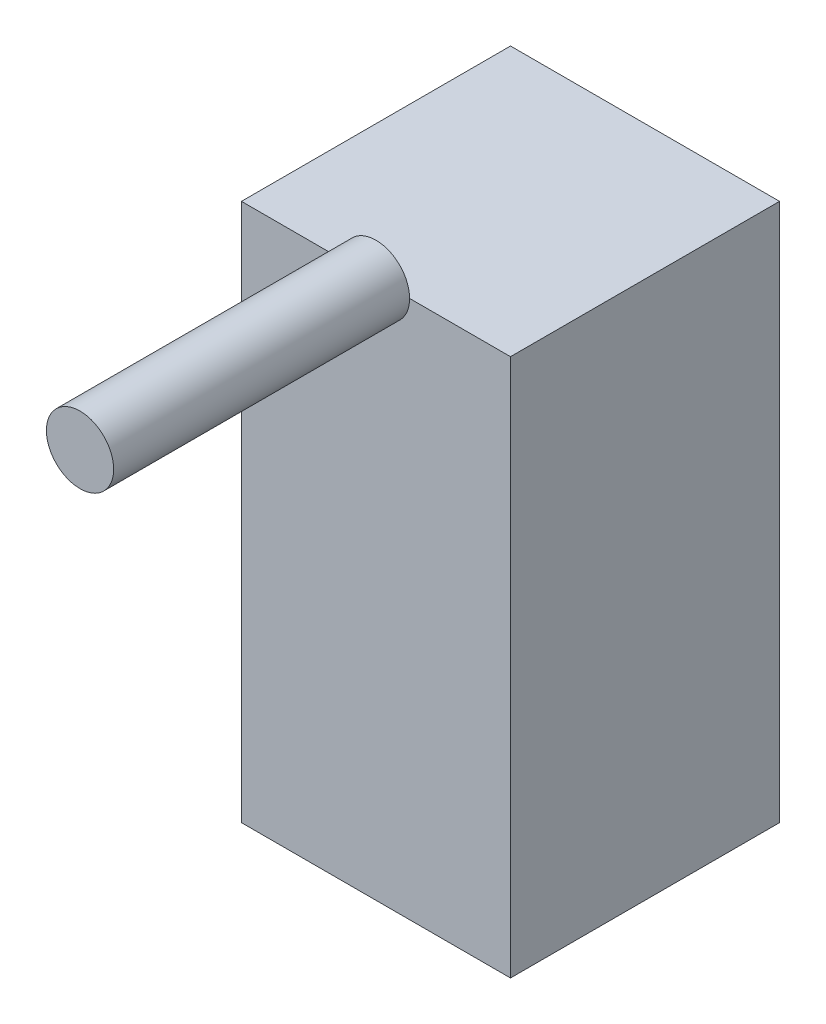
ISO-10303-21;
HEADER;
FILE_DESCRIPTION(('STEP AP214'),'2;1');
FILE_NAME('part.step','',(''),(''),'','','');
FILE_SCHEMA(('AUTOMOTIVE_DESIGN { 1 0 10303 214 1 1 1 1 }'));
ENDSEC;
DATA;
#1=APPLICATION_CONTEXT('core data for automotive mechanical design processes');
#2=APPLICATION_PROTOCOL_DEFINITION('international standard','automotive_design',2000,#1);
#3=PRODUCT_CONTEXT('',#1,'mechanical');
#4=PRODUCT('Part','Part','',(#3));
#5=PRODUCT_RELATED_PRODUCT_CATEGORY('part','',(#4));
#6=PRODUCT_DEFINITION_FORMATION('','',#4);
#7=PRODUCT_DEFINITION_CONTEXT('part definition',#1,'design');
#8=PRODUCT_DEFINITION('design','',#6,#7);
#9=PRODUCT_DEFINITION_SHAPE('','',#8);
#10=(LENGTH_UNIT() NAMED_UNIT(*) SI_UNIT(.MILLI.,.METRE.));
#11=(NAMED_UNIT(*) PLANE_ANGLE_UNIT() SI_UNIT($,.RADIAN.));
#12=(NAMED_UNIT(*) SI_UNIT($,.STERADIAN.) SOLID_ANGLE_UNIT());
#13=UNCERTAINTY_MEASURE_WITH_UNIT(LENGTH_MEASURE(1.E-05),#10,'distance_accuracy_value','');
#14=(GEOMETRIC_REPRESENTATION_CONTEXT(3) GLOBAL_UNCERTAINTY_ASSIGNED_CONTEXT((#13)) GLOBAL_UNIT_ASSIGNED_CONTEXT((#10,
#11,#12)) REPRESENTATION_CONTEXT('',''));
#15=CARTESIAN_POINT('',(0.,0.,0.));
#16=DIRECTION('',(0.,0.,1.));
#17=DIRECTION('',(1.,0.,0.));
#18=AXIS2_PLACEMENT_3D('',#15,#16,#17);
#19=CARTESIAN_POINT('',(10.,40.,-10.));
#20=DIRECTION('',(-1.,0.,0.));
#21=DIRECTION('',(0.,0.,1.));
#22=AXIS2_PLACEMENT_3D('',#19,#20,#21);
#23=PLANE('',#22);
#24=DIRECTION('',(0.,0.,-1.));
#25=VECTOR('',#24,1.);
#26=CARTESIAN_POINT('',(10.,0.,-10.));
#27=LINE('',#26,#25);
#28=CARTESIAN_POINT('',(10.,0.,10.));
#29=VERTEX_POINT('',#28);
#30=CARTESIAN_POINT('',(10.,0.,-10.));
#31=VERTEX_POINT('',#30);
#32=EDGE_CURVE('E116',#29,#31,#27,.T.);
#33=ORIENTED_EDGE('',*,*,#32,.T.);
#34=DIRECTION('',(0.,-1.,0.));
#35=VECTOR('',#34,1.);
#36=CARTESIAN_POINT('',(10.,40.,-10.));
#37=LINE('',#36,#35);
#38=CARTESIAN_POINT('',(10.,40.,-10.));
#39=VERTEX_POINT('',#38);
#40=EDGE_CURVE('E44',#39,#31,#37,.T.);
#41=ORIENTED_EDGE('',*,*,#40,.F.);
#42=DIRECTION('',(0.,0.,-1.));
#43=VECTOR('',#42,1.);
#44=CARTESIAN_POINT('',(10.,40.,-10.));
#45=LINE('',#44,#43);
#46=CARTESIAN_POINT('',(10.,40.,10.));
#47=VERTEX_POINT('',#46);
#48=EDGE_CURVE('E119',#47,#39,#45,.T.);
#49=ORIENTED_EDGE('',*,*,#48,.F.);
#50=DIRECTION('',(0.,-1.,0.));
#51=VECTOR('',#50,1.);
#52=CARTESIAN_POINT('',(10.,40.,10.));
#53=LINE('',#52,#51);
#54=EDGE_CURVE('E105',#47,#29,#53,.T.);
#55=ORIENTED_EDGE('',*,*,#54,.T.);
#56=EDGE_LOOP('',(#33,#41,#49,#55));
#57=FACE_BOUND('',#56,.T.);
#58=ADVANCED_FACE('F41',(#57),#23,.F.);
#59=CARTESIAN_POINT('',(-10.,40.,-10.));
#60=DIRECTION('',(0.,0.,1.));
#61=DIRECTION('',(1.,0.,0.));
#62=AXIS2_PLACEMENT_3D('',#59,#60,#61);
#63=PLANE('',#62);
#64=DIRECTION('',(-1.,0.,0.));
#65=VECTOR('',#64,1.);
#66=CARTESIAN_POINT('',(-10.,0.,-10.));
#67=LINE('',#66,#65);
#68=CARTESIAN_POINT('',(-10.,0.,-10.));
#69=VERTEX_POINT('',#68);
#70=EDGE_CURVE('E130',#31,#69,#67,.T.);
#71=ORIENTED_EDGE('',*,*,#70,.T.);
#72=DIRECTION('',(0.,-1.,0.));
#73=VECTOR('',#72,1.);
#74=CARTESIAN_POINT('',(-10.,40.,-10.));
#75=LINE('',#74,#73);
#76=CARTESIAN_POINT('',(-10.,40.,-10.));
#77=VERTEX_POINT('',#76);
#78=EDGE_CURVE('E142',#77,#69,#75,.T.);
#79=ORIENTED_EDGE('',*,*,#78,.F.);
#80=DIRECTION('',(-1.,0.,0.));
#81=VECTOR('',#80,1.);
#82=CARTESIAN_POINT('',(-10.,40.,-10.));
#83=LINE('',#82,#81);
#84=EDGE_CURVE('E93',#39,#77,#83,.T.);
#85=ORIENTED_EDGE('',*,*,#84,.F.);
#86=ORIENTED_EDGE('',*,*,#40,.T.);
#87=EDGE_LOOP('',(#71,#79,#85,#86));
#88=FACE_BOUND('',#87,.T.);
#89=ADVANCED_FACE('F150',(#88),#63,.F.);
#90=CARTESIAN_POINT('',(-10.,40.,-10.));
#91=DIRECTION('',(1.,0.,0.));
#92=DIRECTION('',(0.,0.,-1.));
#93=AXIS2_PLACEMENT_3D('',#90,#91,#92);
#94=PLANE('',#93);
#95=DIRECTION('',(0.,0.,1.));
#96=VECTOR('',#95,1.);
#97=CARTESIAN_POINT('',(-10.,0.,-10.));
#98=LINE('',#97,#96);
#99=CARTESIAN_POINT('',(-10.,0.,10.));
#100=VERTEX_POINT('',#99);
#101=EDGE_CURVE('E133',#69,#100,#98,.T.);
#102=ORIENTED_EDGE('',*,*,#101,.T.);
#103=DIRECTION('',(0.,-1.,0.));
#104=VECTOR('',#103,1.);
#105=CARTESIAN_POINT('',(-10.,40.,10.));
#106=LINE('',#105,#104);
#107=CARTESIAN_POINT('',(-10.,40.,10.));
#108=VERTEX_POINT('',#107);
#109=EDGE_CURVE('E140',#108,#100,#106,.T.);
#110=ORIENTED_EDGE('',*,*,#109,.F.);
#111=DIRECTION('',(0.,0.,1.));
#112=VECTOR('',#111,1.);
#113=CARTESIAN_POINT('',(-10.,40.,-10.));
#114=LINE('',#113,#112);
#115=EDGE_CURVE('E108',#77,#108,#114,.T.);
#116=ORIENTED_EDGE('',*,*,#115,.F.);
#117=ORIENTED_EDGE('',*,*,#78,.T.);
#118=EDGE_LOOP('',(#102,#110,#116,#117));
#119=FACE_BOUND('',#118,.T.);
#120=ADVANCED_FACE('F156',(#119),#94,.F.);
#121=CARTESIAN_POINT('',(-10.,40.,10.));
#122=DIRECTION('',(0.,0.,-1.));
#123=DIRECTION('',(-1.,0.,0.));
#124=AXIS2_PLACEMENT_3D('',#121,#122,#123);
#125=PLANE('',#124);
#126=CARTESIAN_POINT('',(0.,40.,10.));
#127=DIRECTION('',(0.,0.,1.));
#128=DIRECTION('',(1.,0.,0.));
#129=AXIS2_PLACEMENT_3D('',#126,#127,#128);
#130=CIRCLE('',#129,2.5);
#131=CARTESIAN_POINT('',(-2.5,40.,10.));
#132=VERTEX_POINT('',#131);
#133=CARTESIAN_POINT('',(2.5,40.,10.));
#134=VERTEX_POINT('',#133);
#135=EDGE_CURVE('E11',#132,#134,#130,.T.);
#136=ORIENTED_EDGE('',*,*,#135,.F.);
#137=DIRECTION('',(1.,0.,0.));
#138=VECTOR('',#137,1.);
#139=CARTESIAN_POINT('',(-10.,40.,10.));
#140=LINE('',#139,#138);
#141=EDGE_CURVE('E98',#108,#132,#140,.T.);
#142=ORIENTED_EDGE('',*,*,#141,.F.);
#143=ORIENTED_EDGE('',*,*,#109,.T.);
#144=DIRECTION('',(1.,0.,0.));
#145=VECTOR('',#144,1.);
#146=CARTESIAN_POINT('',(-10.,0.,10.));
#147=LINE('',#146,#145);
#148=EDGE_CURVE('E85',#100,#29,#147,.T.);
#149=ORIENTED_EDGE('',*,*,#148,.T.);
#150=ORIENTED_EDGE('',*,*,#54,.F.);
#151=EDGE_CURVE('E64',#134,#47,#140,.T.);
#152=ORIENTED_EDGE('',*,*,#151,.F.);
#153=EDGE_LOOP('',(#136,#142,#143,#149,#150,#152));
#154=FACE_BOUND('',#153,.T.);
#155=ADVANCED_FACE('F104',(#154),#125,.F.);
#156=CARTESIAN_POINT('',(0.,40.,0.));
#157=DIRECTION('',(0.,1.,0.));
#158=DIRECTION('',(0.,0.,1.));
#159=AXIS2_PLACEMENT_3D('',#156,#157,#158);
#160=PLANE('',#159);
#161=ORIENTED_EDGE('',*,*,#48,.T.);
#162=ORIENTED_EDGE('',*,*,#84,.T.);
#163=ORIENTED_EDGE('',*,*,#115,.T.);
#164=ORIENTED_EDGE('',*,*,#141,.T.);
#165=EDGE_CURVE('E96',#132,#134,#140,.T.);
#166=ORIENTED_EDGE('',*,*,#165,.T.);
#167=ORIENTED_EDGE('',*,*,#151,.T.);
#168=EDGE_LOOP('',(#161,#162,#163,#164,#166,#167));
#169=FACE_BOUND('',#168,.T.);
#170=ADVANCED_FACE('F97',(#169),#160,.T.);
#171=CARTESIAN_POINT('',(0.,0.,0.));
#172=DIRECTION('',(0.,1.,0.));
#173=DIRECTION('',(0.,0.,1.));
#174=AXIS2_PLACEMENT_3D('',#171,#172,#173);
#175=PLANE('',#174);
#176=ORIENTED_EDGE('',*,*,#32,.F.);
#177=ORIENTED_EDGE('',*,*,#148,.F.);
#178=ORIENTED_EDGE('',*,*,#101,.F.);
#179=ORIENTED_EDGE('',*,*,#70,.F.);
#180=EDGE_LOOP('',(#176,#177,#178,#179));
#181=FACE_BOUND('',#180,.T.);
#182=ADVANCED_FACE('F154',(#181),#175,.F.);
#183=CARTESIAN_POINT('',(0.,40.,32.));
#184=DIRECTION('',(0.,0.,-1.));
#185=DIRECTION('',(-1.,0.,0.));
#186=AXIS2_PLACEMENT_3D('',#183,#184,#185);
#187=CYLINDRICAL_SURFACE('',#186,2.5);
#188=CARTESIAN_POINT('',(0.,40.,32.));
#189=DIRECTION('',(0.,0.,1.));
#190=DIRECTION('',(1.,0.,0.));
#191=AXIS2_PLACEMENT_3D('',#188,#189,#190);
#192=CIRCLE('',#191,2.5);
#193=CARTESIAN_POINT('',(2.5,40.,32.));
#194=VERTEX_POINT('',#193);
#195=EDGE_CURVE('E113',#194,#194,#192,.T.);
#196=ORIENTED_EDGE('',*,*,#195,.F.);
#197=EDGE_LOOP('',(#196));
#198=FACE_BOUND('',#197,.T.);
#199=EDGE_CURVE('E51',#134,#132,#130,.T.);
#200=ORIENTED_EDGE('',*,*,#199,.T.);
#201=ORIENTED_EDGE('',*,*,#135,.T.);
#202=EDGE_LOOP('',(#200,#201));
#203=FACE_BOUND('',#202,.T.);
#204=ADVANCED_FACE('F110',(#198,#203),#187,.T.);
#205=CARTESIAN_POINT('',(0.,40.,32.));
#206=DIRECTION('',(0.,0.,1.));
#207=DIRECTION('',(1.,0.,0.));
#208=AXIS2_PLACEMENT_3D('',#205,#206,#207);
#209=PLANE('',#208);
#210=ORIENTED_EDGE('',*,*,#195,.T.);
#211=EDGE_LOOP('',(#210));
#212=FACE_BOUND('',#211,.T.);
#213=ADVANCED_FACE('F206',(#212),#209,.T.);
#214=CARTESIAN_POINT('',(0.,40.,10.));
#215=DIRECTION('',(0.,0.,1.));
#216=DIRECTION('',(1.,0.,0.));
#217=AXIS2_PLACEMENT_3D('',#214,#215,#216);
#218=PLANE('',#217);
#219=ORIENTED_EDGE('',*,*,#165,.F.);
#220=ORIENTED_EDGE('',*,*,#199,.F.);
#221=EDGE_LOOP('',(#219,#220));
#222=FACE_BOUND('',#221,.T.);
#223=ADVANCED_FACE('F111',(#222),#218,.F.);
#224=CLOSED_SHELL('',(#58,#89,#120,#155,#170,#182,#204,#213,#223));
#225=MANIFOLD_SOLID_BREP('B2',#224);
#226=ADVANCED_BREP_SHAPE_REPRESENTATION('',(#18,#225),#14);
#227=SHAPE_DEFINITION_REPRESENTATION(#9,#226);
ENDSEC;
END-ISO-10303-21;
